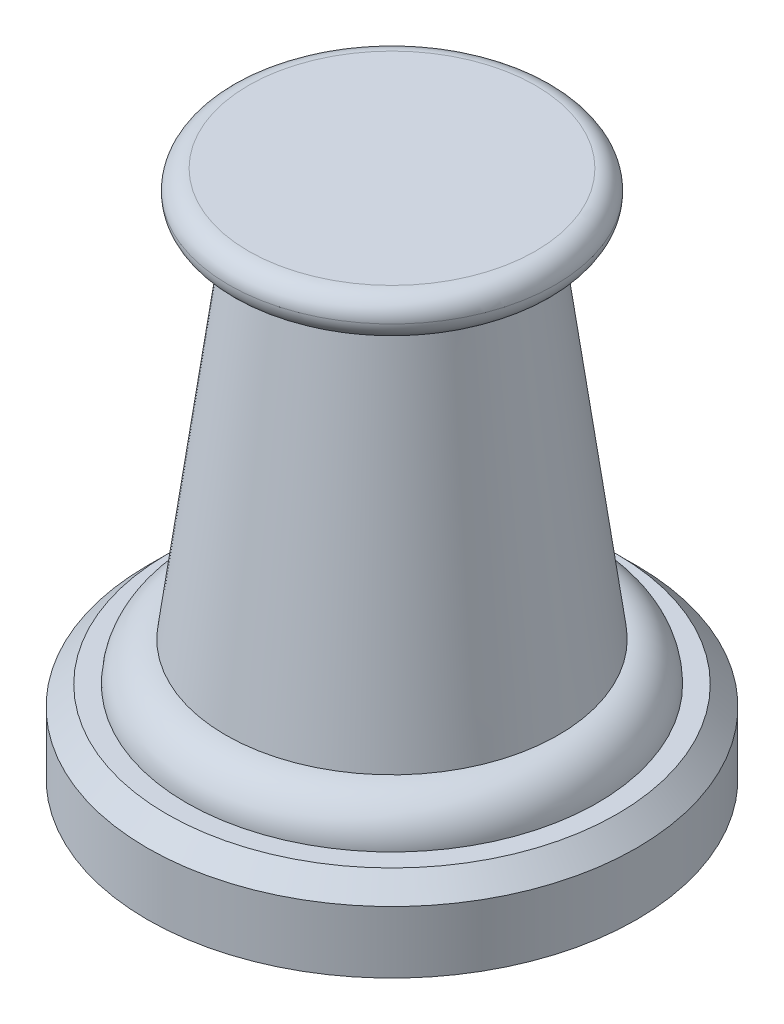
ISO-10303-21;
HEADER;
FILE_DESCRIPTION(('STEP AP214'),'2;1');
FILE_NAME('part.step','',(''),(''),'','','');
FILE_SCHEMA(('AUTOMOTIVE_DESIGN { 1 0 10303 214 1 1 1 1 }'));
ENDSEC;
DATA;
#1=APPLICATION_CONTEXT('core data for automotive mechanical design processes');
#2=APPLICATION_PROTOCOL_DEFINITION('international standard','automotive_design',2000,#1);
#3=PRODUCT_CONTEXT('',#1,'mechanical');
#4=PRODUCT('Part','Part','',(#3));
#5=PRODUCT_RELATED_PRODUCT_CATEGORY('part','',(#4));
#6=PRODUCT_DEFINITION_FORMATION('','',#4);
#7=PRODUCT_DEFINITION_CONTEXT('part definition',#1,'design');
#8=PRODUCT_DEFINITION('design','',#6,#7);
#9=PRODUCT_DEFINITION_SHAPE('','',#8);
#10=(LENGTH_UNIT() NAMED_UNIT(*) SI_UNIT(.MILLI.,.METRE.));
#11=(NAMED_UNIT(*) PLANE_ANGLE_UNIT() SI_UNIT($,.RADIAN.));
#12=(NAMED_UNIT(*) SI_UNIT($,.STERADIAN.) SOLID_ANGLE_UNIT());
#13=UNCERTAINTY_MEASURE_WITH_UNIT(LENGTH_MEASURE(1.E-05),#10,'distance_accuracy_value','');
#14=(GEOMETRIC_REPRESENTATION_CONTEXT(3) GLOBAL_UNCERTAINTY_ASSIGNED_CONTEXT((#13)) GLOBAL_UNIT_ASSIGNED_CONTEXT((#10,
#11,#12)) REPRESENTATION_CONTEXT('',''));
#15=CARTESIAN_POINT('',(0.,0.,0.));
#16=DIRECTION('',(0.,0.,1.));
#17=DIRECTION('',(1.,0.,0.));
#18=AXIS2_PLACEMENT_3D('',#15,#16,#17);
#19=CARTESIAN_POINT('',(0.,0.,0.));
#20=DIRECTION('',(0.,-1.,0.));
#21=DIRECTION('',(0.,0.,-1.));
#22=AXIS2_PLACEMENT_3D('',#19,#20,#21);
#23=PLANE('',#22);
#24=CARTESIAN_POINT('',(0.,0.,0.));
#25=DIRECTION('',(0.,1.,0.));
#26=DIRECTION('',(0.,0.,1.));
#27=AXIS2_PLACEMENT_3D('',#24,#25,#26);
#28=CIRCLE('',#27,9.525);
#29=CARTESIAN_POINT('',(0.,0.,9.525));
#30=VERTEX_POINT('',#29);
#31=EDGE_CURVE('E56',#30,#30,#28,.T.);
#32=ORIENTED_EDGE('',*,*,#31,.F.);
#33=EDGE_LOOP('',(#32));
#34=FACE_BOUND('',#33,.T.);
#35=ADVANCED_FACE('F36',(#34),#23,.T.);
#36=CARTESIAN_POINT('',(0.,20.574,0.));
#37=DIRECTION('',(0.,1.,0.));
#38=DIRECTION('',(0.,0.,1.));
#39=AXIS2_PLACEMENT_3D('',#36,#37,#38);
#40=CYLINDRICAL_SURFACE('',#39,9.525);
#41=CARTESIAN_POINT('',(0.,2.413,0.));
#42=DIRECTION('',(0.,1.,0.));
#43=DIRECTION('',(0.,0.,1.));
#44=AXIS2_PLACEMENT_3D('',#41,#42,#43);
#45=CIRCLE('',#44,9.525);
#46=CARTESIAN_POINT('',(0.,2.413,9.525));
#47=VERTEX_POINT('',#46);
#48=EDGE_CURVE('E48',#47,#47,#45,.F.);
#49=ORIENTED_EDGE('',*,*,#48,.T.);
#50=EDGE_LOOP('',(#49));
#51=FACE_BOUND('',#50,.T.);
#52=ORIENTED_EDGE('',*,*,#31,.T.);
#53=EDGE_LOOP('',(#52));
#54=FACE_BOUND('',#53,.T.);
#55=ADVANCED_FACE('F86',(#51,#54),#40,.T.);
#56=CARTESIAN_POINT('',(-9.525,3.175,0.));
#57=DIRECTION('',(0.,1.,0.));
#58=DIRECTION('',(0.,0.,1.));
#59=AXIS2_PLACEMENT_3D('',#56,#57,#58);
#60=PLANE('',#59);
#61=CARTESIAN_POINT('',(0.,3.175,0.));
#62=DIRECTION('',(0.,1.,0.));
#63=DIRECTION('',(0.,0.,1.));
#64=AXIS2_PLACEMENT_3D('',#61,#62,#63);
#65=CIRCLE('',#64,8.76300000000001);
#66=CARTESIAN_POINT('',(0.,3.175,8.76300000000001));
#67=VERTEX_POINT('',#66);
#68=EDGE_CURVE('E53',#67,#67,#65,.T.);
#69=ORIENTED_EDGE('',*,*,#68,.T.);
#70=EDGE_LOOP('',(#69));
#71=FACE_BOUND('',#70,.T.);
#72=CARTESIAN_POINT('',(0.,3.175,0.));
#73=DIRECTION('',(0.,1.,0.));
#74=DIRECTION('',(0.,0.,1.));
#75=AXIS2_PLACEMENT_3D('',#72,#73,#74);
#76=CIRCLE('',#75,8.001);
#77=CARTESIAN_POINT('',(0.,3.175,8.001));
#78=VERTEX_POINT('',#77);
#79=EDGE_CURVE('E59',#78,#78,#76,.T.);
#80=ORIENTED_EDGE('',*,*,#79,.F.);
#81=EDGE_LOOP('',(#80));
#82=FACE_BOUND('',#81,.T.);
#83=ADVANCED_FACE('F92',(#71,#82),#60,.T.);
#84=CARTESIAN_POINT('',(0.,19.05,0.));
#85=DIRECTION('',(0.,-1.,0.));
#86=DIRECTION('',(0.,0.,-1.));
#87=AXIS2_PLACEMENT_3D('',#84,#85,#86);
#88=CONICAL_SURFACE('',#87,4.572,0.131971822216686);
#89=CARTESIAN_POINT('',(0.,4.699,0.));
#90=DIRECTION('',(0.,1.,0.));
#91=DIRECTION('',(0.,0.,1.));
#92=AXIS2_PLACEMENT_3D('',#89,#90,#91);
#93=CIRCLE('',#92,6.477);
#94=CARTESIAN_POINT('',(0.,4.699,6.477));
#95=VERTEX_POINT('',#94);
#96=EDGE_CURVE('E62',#95,#95,#93,.T.);
#97=ORIENTED_EDGE('',*,*,#96,.T.);
#98=EDGE_LOOP('',(#97));
#99=FACE_BOUND('',#98,.T.);
#100=CARTESIAN_POINT('',(0.,19.05,0.));
#101=DIRECTION('',(0.,1.,0.));
#102=DIRECTION('',(0.,0.,1.));
#103=AXIS2_PLACEMENT_3D('',#100,#101,#102);
#104=CIRCLE('',#103,4.572);
#105=CARTESIAN_POINT('',(0.,19.05,4.572));
#106=VERTEX_POINT('',#105);
#107=EDGE_CURVE('E65',#106,#106,#104,.T.);
#108=ORIENTED_EDGE('',*,*,#107,.F.);
#109=EDGE_LOOP('',(#108));
#110=FACE_BOUND('',#109,.T.);
#111=ADVANCED_FACE('F116',(#99,#110),#88,.T.);
#112=CARTESIAN_POINT('',(-4.572,19.05,0.));
#113=DIRECTION('',(0.,-1.,0.));
#114=DIRECTION('',(0.,0.,-1.));
#115=AXIS2_PLACEMENT_3D('',#112,#113,#114);
#116=PLANE('',#115);
#117=CARTESIAN_POINT('',(0.,19.05,0.));
#118=DIRECTION('',(0.,-1.,0.));
#119=DIRECTION('',(0.,0.,-1.));
#120=AXIS2_PLACEMENT_3D('',#117,#118,#119);
#121=CIRCLE('',#120,5.588);
#122=CARTESIAN_POINT('',(0.,19.05,-5.588));
#123=VERTEX_POINT('',#122);
#124=EDGE_CURVE('E10',#123,#123,#121,.T.);
#125=ORIENTED_EDGE('',*,*,#124,.T.);
#126=EDGE_LOOP('',(#125));
#127=FACE_BOUND('',#126,.T.);
#128=ORIENTED_EDGE('',*,*,#107,.T.);
#129=EDGE_LOOP('',(#128));
#130=FACE_BOUND('',#129,.T.);
#131=ADVANCED_FACE('F107',(#127,#130),#116,.T.);
#132=CARTESIAN_POINT('',(-6.35,20.574,0.));
#133=DIRECTION('',(0.,1.,0.));
#134=DIRECTION('',(0.,0.,1.));
#135=AXIS2_PLACEMENT_3D('',#132,#133,#134);
#136=PLANE('',#135);
#137=CARTESIAN_POINT('',(0.,20.574,0.));
#138=DIRECTION('',(0.,1.,0.));
#139=DIRECTION('',(0.,0.,1.));
#140=AXIS2_PLACEMENT_3D('',#137,#138,#139);
#141=CIRCLE('',#140,5.588);
#142=CARTESIAN_POINT('',(0.,20.574,5.588));
#143=VERTEX_POINT('',#142);
#144=EDGE_CURVE('E44',#143,#143,#141,.T.);
#145=ORIENTED_EDGE('',*,*,#144,.T.);
#146=EDGE_LOOP('',(#145));
#147=FACE_BOUND('',#146,.T.);
#148=ADVANCED_FACE('F102',(#147),#136,.T.);
#149=CARTESIAN_POINT('',(0.,3.175,0.));
#150=DIRECTION('',(0.,-1.,0.));
#151=DIRECTION('',(0.,0.,-1.));
#152=AXIS2_PLACEMENT_3D('',#149,#150,#151);
#153=CONICAL_SURFACE('',#152,8.76300000000001,0.785398163397442);
#154=ORIENTED_EDGE('',*,*,#48,.F.);
#155=EDGE_LOOP('',(#154));
#156=FACE_BOUND('',#155,.T.);
#157=ORIENTED_EDGE('',*,*,#68,.F.);
#158=EDGE_LOOP('',(#157));
#159=FACE_BOUND('',#158,.T.);
#160=ADVANCED_FACE('F82',(#156,#159),#153,.T.);
#161=CARTESIAN_POINT('',(0.,3.175,0.));
#162=DIRECTION('',(0.,1.,0.));
#163=DIRECTION('',(0.,0.,1.));
#164=AXIS2_PLACEMENT_3D('',#161,#162,#163);
#165=TOROIDAL_SURFACE('',#164,6.477,1.524);
#166=ORIENTED_EDGE('',*,*,#79,.T.);
#167=EDGE_LOOP('',(#166));
#168=FACE_BOUND('',#167,.T.);
#169=ORIENTED_EDGE('',*,*,#96,.F.);
#170=EDGE_LOOP('',(#169));
#171=FACE_BOUND('',#170,.T.);
#172=ADVANCED_FACE('F76',(#168,#171),#165,.T.);
#173=CARTESIAN_POINT('',(0.,19.812,0.));
#174=DIRECTION('',(0.,-1.,0.));
#175=DIRECTION('',(0.,0.,-1.));
#176=AXIS2_PLACEMENT_3D('',#173,#174,#175);
#177=TOROIDAL_SURFACE('',#176,5.588,0.762);
#178=ORIENTED_EDGE('',*,*,#124,.F.);
#179=EDGE_LOOP('',(#178));
#180=FACE_BOUND('',#179,.T.);
#181=CARTESIAN_POINT('',(0.,19.812,0.));
#182=DIRECTION('',(0.,-1.,0.));
#183=DIRECTION('',(0.,0.,-1.));
#184=AXIS2_PLACEMENT_3D('',#181,#182,#183);
#185=CIRCLE('',#184,6.35);
#186=CARTESIAN_POINT('',(0.,19.812,-6.35));
#187=VERTEX_POINT('',#186);
#188=EDGE_CURVE('E40',#187,#187,#185,.F.);
#189=ORIENTED_EDGE('',*,*,#188,.F.);
#190=EDGE_LOOP('',(#189));
#191=FACE_BOUND('',#190,.T.);
#192=ADVANCED_FACE('F38',(#180,#191),#177,.T.);
#193=CARTESIAN_POINT('',(0.,19.812,0.));
#194=DIRECTION('',(0.,1.,0.));
#195=DIRECTION('',(0.,0.,1.));
#196=AXIS2_PLACEMENT_3D('',#193,#194,#195);
#197=TOROIDAL_SURFACE('',#196,5.588,0.762);
#198=ORIENTED_EDGE('',*,*,#188,.T.);
#199=EDGE_LOOP('',(#198));
#200=FACE_BOUND('',#199,.T.);
#201=ORIENTED_EDGE('',*,*,#144,.F.);
#202=EDGE_LOOP('',(#201));
#203=FACE_BOUND('',#202,.T.);
#204=ADVANCED_FACE('F72',(#200,#203),#197,.T.);
#205=CLOSED_SHELL('',(#35,#55,#83,#111,#131,#148,#160,#172,#192,#204));
#206=MANIFOLD_SOLID_BREP('B2',#205);
#207=ADVANCED_BREP_SHAPE_REPRESENTATION('',(#18,#206),#14);
#208=SHAPE_DEFINITION_REPRESENTATION(#9,#207);
ENDSEC;
END-ISO-10303-21;
